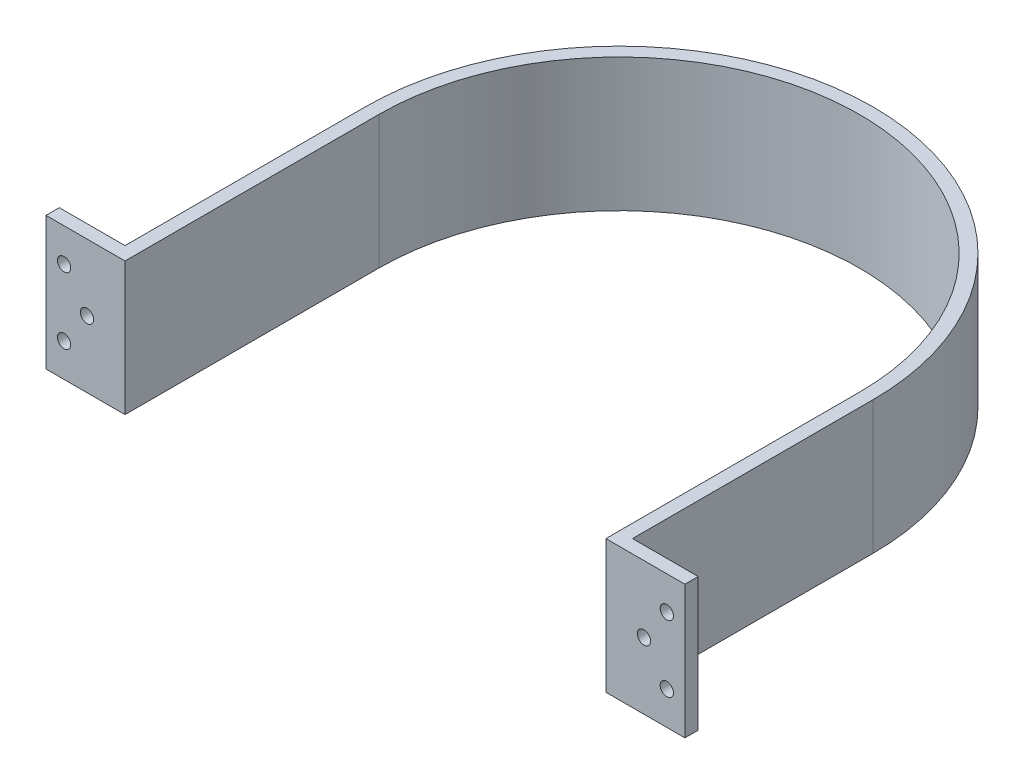
ISO-10303-21;
HEADER;
FILE_DESCRIPTION(('STEP AP214'),'2;1');
FILE_NAME('part.step','',(''),(''),'','','');
FILE_SCHEMA(('AUTOMOTIVE_DESIGN { 1 0 10303 214 1 1 1 1 }'));
ENDSEC;
DATA;
#1=APPLICATION_CONTEXT('core data for automotive mechanical design processes');
#2=APPLICATION_PROTOCOL_DEFINITION('international standard','automotive_design',2000,#1);
#3=PRODUCT_CONTEXT('',#1,'mechanical');
#4=PRODUCT('Part','Part','',(#3));
#5=PRODUCT_RELATED_PRODUCT_CATEGORY('part','',(#4));
#6=PRODUCT_DEFINITION_FORMATION('','',#4);
#7=PRODUCT_DEFINITION_CONTEXT('part definition',#1,'design');
#8=PRODUCT_DEFINITION('design','',#6,#7);
#9=PRODUCT_DEFINITION_SHAPE('','',#8);
#10=(LENGTH_UNIT() NAMED_UNIT(*) SI_UNIT(.MILLI.,.METRE.));
#11=(NAMED_UNIT(*) PLANE_ANGLE_UNIT() SI_UNIT($,.RADIAN.));
#12=(NAMED_UNIT(*) SI_UNIT($,.STERADIAN.) SOLID_ANGLE_UNIT());
#13=UNCERTAINTY_MEASURE_WITH_UNIT(LENGTH_MEASURE(1.E-05),#10,'distance_accuracy_value','');
#14=(GEOMETRIC_REPRESENTATION_CONTEXT(3) GLOBAL_UNCERTAINTY_ASSIGNED_CONTEXT((#13)) GLOBAL_UNIT_ASSIGNED_CONTEXT((#10,
#11,#12)) REPRESENTATION_CONTEXT('',''));
#15=CARTESIAN_POINT('',(0.,0.,0.));
#16=DIRECTION('',(0.,0.,1.));
#17=DIRECTION('',(1.,0.,0.));
#18=AXIS2_PLACEMENT_3D('',#15,#16,#17);
#19=CARTESIAN_POINT('',(0.,31.75,114.7));
#20=DIRECTION('',(0.,0.,1.));
#21=DIRECTION('',(1.,0.,0.));
#22=AXIS2_PLACEMENT_3D('',#19,#20,#21);
#23=PLANE('',#22);
#24=CARTESIAN_POINT('',(-132.85625,0.,114.7));
#25=DIRECTION('',(0.,0.,1.));
#26=DIRECTION('',(1.,0.,0.));
#27=AXIS2_PLACEMENT_3D('',#24,#25,#26);
#28=CIRCLE('',#27,3.175);
#29=CARTESIAN_POINT('',(-129.68125,0.,114.7));
#30=VERTEX_POINT('',#29);
#31=EDGE_CURVE('E166',#30,#30,#28,.T.);
#32=ORIENTED_EDGE('',*,*,#31,.T.);
#33=EDGE_LOOP('',(#32));
#34=FACE_BOUND('',#33,.T.);
#35=CARTESIAN_POINT('',(-143.76875,15.875,114.7));
#36=DIRECTION('',(0.,0.,1.));
#37=DIRECTION('',(1.,0.,0.));
#38=AXIS2_PLACEMENT_3D('',#35,#36,#37);
#39=CIRCLE('',#38,3.175);
#40=CARTESIAN_POINT('',(-140.59375,15.875,114.7));
#41=VERTEX_POINT('',#40);
#42=EDGE_CURVE('E218',#41,#41,#39,.T.);
#43=ORIENTED_EDGE('',*,*,#42,.T.);
#44=EDGE_LOOP('',(#43));
#45=FACE_BOUND('',#44,.T.);
#46=DIRECTION('',(-1.,0.,0.));
#47=VECTOR('',#46,1.);
#48=CARTESIAN_POINT('',(0.,-31.75,114.7));
#49=LINE('',#48,#47);
#50=CARTESIAN_POINT('',(-121.05,-31.75,114.7));
#51=VERTEX_POINT('',#50);
#52=CARTESIAN_POINT('',(-152.4,-31.75,114.7));
#53=VERTEX_POINT('',#52);
#54=EDGE_CURVE('E162',#51,#53,#49,.T.);
#55=ORIENTED_EDGE('',*,*,#54,.T.);
#56=DIRECTION('',(0.,-1.,0.));
#57=VECTOR('',#56,1.);
#58=CARTESIAN_POINT('',(-152.4,31.75,114.7));
#59=LINE('',#58,#57);
#60=CARTESIAN_POINT('',(-152.4,31.75,114.7));
#61=VERTEX_POINT('',#60);
#62=EDGE_CURVE('E11',#61,#53,#59,.T.);
#63=ORIENTED_EDGE('',*,*,#62,.F.);
#64=DIRECTION('',(-1.,0.,0.));
#65=VECTOR('',#64,1.);
#66=CARTESIAN_POINT('',(0.,31.75,114.7));
#67=LINE('',#66,#65);
#68=CARTESIAN_POINT('',(-121.05,31.75,114.7));
#69=VERTEX_POINT('',#68);
#70=EDGE_CURVE('E192',#69,#61,#67,.T.);
#71=ORIENTED_EDGE('',*,*,#70,.F.);
#72=DIRECTION('',(0.,-1.,0.));
#73=VECTOR('',#72,1.);
#74=CARTESIAN_POINT('',(-121.05,31.75,114.7));
#75=LINE('',#74,#73);
#76=EDGE_CURVE('E161',#69,#51,#75,.T.);
#77=ORIENTED_EDGE('',*,*,#76,.T.);
#78=EDGE_LOOP('',(#55,#63,#71,#77));
#79=FACE_BOUND('',#78,.T.);
#80=CARTESIAN_POINT('',(-143.76875,-15.875,114.7));
#81=DIRECTION('',(0.,0.,1.));
#82=DIRECTION('',(1.,0.,0.));
#83=AXIS2_PLACEMENT_3D('',#80,#81,#82);
#84=CIRCLE('',#83,3.175);
#85=CARTESIAN_POINT('',(-140.59375,-15.875,114.7));
#86=VERTEX_POINT('',#85);
#87=EDGE_CURVE('E222',#86,#86,#84,.F.);
#88=ORIENTED_EDGE('',*,*,#87,.F.);
#89=EDGE_LOOP('',(#88));
#90=FACE_BOUND('',#89,.T.);
#91=ADVANCED_FACE('F38',(#34,#45,#79,#90),#23,.F.);
#92=CARTESIAN_POINT('',(0.,31.75,121.05));
#93=DIRECTION('',(0.,0.,1.));
#94=DIRECTION('',(1.,0.,0.));
#95=AXIS2_PLACEMENT_3D('',#92,#93,#94);
#96=PLANE('',#95);
#97=CARTESIAN_POINT('',(-132.85625,0.,121.05));
#98=DIRECTION('',(0.,0.,1.));
#99=DIRECTION('',(1.,0.,0.));
#100=AXIS2_PLACEMENT_3D('',#97,#98,#99);
#101=CIRCLE('',#100,3.175);
#102=CARTESIAN_POINT('',(-129.68125,0.,121.05));
#103=VERTEX_POINT('',#102);
#104=EDGE_CURVE('E327',#103,#103,#101,.T.);
#105=ORIENTED_EDGE('',*,*,#104,.F.);
#106=EDGE_LOOP('',(#105));
#107=FACE_BOUND('',#106,.T.);
#108=DIRECTION('',(-1.,0.,0.));
#109=VECTOR('',#108,1.);
#110=CARTESIAN_POINT('',(0.,-31.75,121.05));
#111=LINE('',#110,#109);
#112=CARTESIAN_POINT('',(-114.7,-31.75,121.05));
#113=VERTEX_POINT('',#112);
#114=CARTESIAN_POINT('',(-152.4,-31.75,121.05));
#115=VERTEX_POINT('',#114);
#116=EDGE_CURVE('E169',#113,#115,#111,.T.);
#117=ORIENTED_EDGE('',*,*,#116,.F.);
#118=DIRECTION('',(0.,-1.,0.));
#119=VECTOR('',#118,1.);
#120=CARTESIAN_POINT('',(-114.7,31.75,121.05));
#121=LINE('',#120,#119);
#122=CARTESIAN_POINT('',(-114.7,31.75,121.05));
#123=VERTEX_POINT('',#122);
#124=EDGE_CURVE('E207',#123,#113,#121,.T.);
#125=ORIENTED_EDGE('',*,*,#124,.F.);
#126=DIRECTION('',(-1.,0.,0.));
#127=VECTOR('',#126,1.);
#128=CARTESIAN_POINT('',(0.,31.75,121.05));
#129=LINE('',#128,#127);
#130=CARTESIAN_POINT('',(-152.4,31.75,121.05));
#131=VERTEX_POINT('',#130);
#132=EDGE_CURVE('E235',#123,#131,#129,.T.);
#133=ORIENTED_EDGE('',*,*,#132,.T.);
#134=DIRECTION('',(0.,-1.,0.));
#135=VECTOR('',#134,1.);
#136=CARTESIAN_POINT('',(-152.4,31.75,121.05));
#137=LINE('',#136,#135);
#138=EDGE_CURVE('E47',#131,#115,#137,.T.);
#139=ORIENTED_EDGE('',*,*,#138,.T.);
#140=EDGE_LOOP('',(#117,#125,#133,#139));
#141=FACE_BOUND('',#140,.T.);
#142=CARTESIAN_POINT('',(-143.76875,15.875,121.05));
#143=DIRECTION('',(0.,0.,1.));
#144=DIRECTION('',(1.,0.,0.));
#145=AXIS2_PLACEMENT_3D('',#142,#143,#144);
#146=CIRCLE('',#145,3.175);
#147=CARTESIAN_POINT('',(-140.59375,15.875,121.05));
#148=VERTEX_POINT('',#147);
#149=EDGE_CURVE('E213',#148,#148,#146,.T.);
#150=ORIENTED_EDGE('',*,*,#149,.F.);
#151=EDGE_LOOP('',(#150));
#152=FACE_BOUND('',#151,.T.);
#153=CARTESIAN_POINT('',(-143.76875,-15.875,121.05));
#154=DIRECTION('',(0.,0.,-1.));
#155=DIRECTION('',(-1.,0.,0.));
#156=AXIS2_PLACEMENT_3D('',#153,#154,#155);
#157=CIRCLE('',#156,3.175);
#158=CARTESIAN_POINT('',(-146.94375,-15.875,121.05));
#159=VERTEX_POINT('',#158);
#160=EDGE_CURVE('E329',#159,#159,#157,.T.);
#161=ORIENTED_EDGE('',*,*,#160,.T.);
#162=EDGE_LOOP('',(#161));
#163=FACE_BOUND('',#162,.T.);
#164=ADVANCED_FACE('F274',(#107,#141,#152,#163),#96,.T.);
#165=CARTESIAN_POINT('',(0.,31.75,121.05));
#166=DIRECTION('',(0.,0.,-1.));
#167=DIRECTION('',(-1.,0.,0.));
#168=AXIS2_PLACEMENT_3D('',#165,#166,#167);
#169=PLANE('',#168);
#170=CARTESIAN_POINT('',(143.76875,-15.875,121.05));
#171=DIRECTION('',(0.,0.,1.));
#172=DIRECTION('',(1.,0.,0.));
#173=AXIS2_PLACEMENT_3D('',#170,#171,#172);
#174=CIRCLE('',#173,3.175);
#175=CARTESIAN_POINT('',(146.94375,-15.875,121.05));
#176=VERTEX_POINT('',#175);
#177=EDGE_CURVE('E320',#176,#176,#174,.T.);
#178=ORIENTED_EDGE('',*,*,#177,.F.);
#179=EDGE_LOOP('',(#178));
#180=FACE_BOUND('',#179,.T.);
#181=DIRECTION('',(1.,0.,0.));
#182=VECTOR('',#181,1.);
#183=CARTESIAN_POINT('',(0.,-31.75,121.05));
#184=LINE('',#183,#182);
#185=CARTESIAN_POINT('',(114.7,-31.75,121.05));
#186=VERTEX_POINT('',#185);
#187=CARTESIAN_POINT('',(152.4,-31.75,121.05));
#188=VERTEX_POINT('',#187);
#189=EDGE_CURVE('E180',#186,#188,#184,.T.);
#190=ORIENTED_EDGE('',*,*,#189,.T.);
#191=DIRECTION('',(0.,-1.,0.));
#192=VECTOR('',#191,1.);
#193=CARTESIAN_POINT('',(152.4,31.75,121.05));
#194=LINE('',#193,#192);
#195=CARTESIAN_POINT('',(152.4,31.75,121.05));
#196=VERTEX_POINT('',#195);
#197=EDGE_CURVE('E198',#196,#188,#194,.T.);
#198=ORIENTED_EDGE('',*,*,#197,.F.);
#199=DIRECTION('',(1.,0.,0.));
#200=VECTOR('',#199,1.);
#201=CARTESIAN_POINT('',(0.,31.75,121.05));
#202=LINE('',#201,#200);
#203=CARTESIAN_POINT('',(114.7,31.75,121.05));
#204=VERTEX_POINT('',#203);
#205=EDGE_CURVE('E246',#204,#196,#202,.T.);
#206=ORIENTED_EDGE('',*,*,#205,.F.);
#207=DIRECTION('',(0.,-1.,0.));
#208=VECTOR('',#207,1.);
#209=CARTESIAN_POINT('',(114.7,31.75,121.05));
#210=LINE('',#209,#208);
#211=EDGE_CURVE('E200',#204,#186,#210,.T.);
#212=ORIENTED_EDGE('',*,*,#211,.T.);
#213=EDGE_LOOP('',(#190,#198,#206,#212));
#214=FACE_BOUND('',#213,.T.);
#215=CARTESIAN_POINT('',(143.76875,15.875,121.05));
#216=DIRECTION('',(0.,0.,-1.));
#217=DIRECTION('',(-1.,0.,0.));
#218=AXIS2_PLACEMENT_3D('',#215,#216,#217);
#219=CIRCLE('',#218,3.175);
#220=CARTESIAN_POINT('',(140.59375,15.875,121.05));
#221=VERTEX_POINT('',#220);
#222=EDGE_CURVE('E322',#221,#221,#219,.T.);
#223=ORIENTED_EDGE('',*,*,#222,.T.);
#224=EDGE_LOOP('',(#223));
#225=FACE_BOUND('',#224,.T.);
#226=CARTESIAN_POINT('',(132.85625,0.,121.05));
#227=DIRECTION('',(0.,0.,-1.));
#228=DIRECTION('',(-1.,0.,0.));
#229=AXIS2_PLACEMENT_3D('',#226,#227,#228);
#230=CIRCLE('',#229,3.175);
#231=CARTESIAN_POINT('',(129.68125,0.,121.05));
#232=VERTEX_POINT('',#231);
#233=EDGE_CURVE('E325',#232,#232,#230,.T.);
#234=ORIENTED_EDGE('',*,*,#233,.T.);
#235=EDGE_LOOP('',(#234));
#236=FACE_BOUND('',#235,.T.);
#237=ADVANCED_FACE('F279',(#180,#214,#225,#236),#169,.F.);
#238=CARTESIAN_POINT('',(0.,31.75,114.7));
#239=DIRECTION('',(0.,0.,-1.));
#240=DIRECTION('',(-1.,0.,0.));
#241=AXIS2_PLACEMENT_3D('',#238,#239,#240);
#242=PLANE('',#241);
#243=CARTESIAN_POINT('',(143.76875,15.875,114.7));
#244=DIRECTION('',(0.,0.,-1.));
#245=DIRECTION('',(-1.,0.,0.));
#246=AXIS2_PLACEMENT_3D('',#243,#244,#245);
#247=CIRCLE('',#246,3.175);
#248=CARTESIAN_POINT('',(140.59375,15.875,114.7));
#249=VERTEX_POINT('',#248);
#250=EDGE_CURVE('E212',#249,#249,#247,.F.);
#251=ORIENTED_EDGE('',*,*,#250,.T.);
#252=EDGE_LOOP('',(#251));
#253=FACE_BOUND('',#252,.T.);
#254=CARTESIAN_POINT('',(143.76875,-15.875,114.7));
#255=DIRECTION('',(0.,0.,-1.));
#256=DIRECTION('',(-1.,0.,0.));
#257=AXIS2_PLACEMENT_3D('',#254,#255,#256);
#258=CIRCLE('',#257,3.175);
#259=CARTESIAN_POINT('',(140.59375,-15.875,114.7));
#260=VERTEX_POINT('',#259);
#261=EDGE_CURVE('E210',#260,#260,#258,.T.);
#262=ORIENTED_EDGE('',*,*,#261,.F.);
#263=EDGE_LOOP('',(#262));
#264=FACE_BOUND('',#263,.T.);
#265=DIRECTION('',(1.,0.,0.));
#266=VECTOR('',#265,1.);
#267=CARTESIAN_POINT('',(0.,-31.75,114.7));
#268=LINE('',#267,#266);
#269=CARTESIAN_POINT('',(121.05,-31.75,114.7));
#270=VERTEX_POINT('',#269);
#271=CARTESIAN_POINT('',(152.4,-31.75,114.7));
#272=VERTEX_POINT('',#271);
#273=EDGE_CURVE('E186',#270,#272,#268,.T.);
#274=ORIENTED_EDGE('',*,*,#273,.F.);
#275=DIRECTION('',(0.,-1.,0.));
#276=VECTOR('',#275,1.);
#277=CARTESIAN_POINT('',(121.05,31.75,114.7));
#278=LINE('',#277,#276);
#279=CARTESIAN_POINT('',(121.05,31.75,114.7));
#280=VERTEX_POINT('',#279);
#281=EDGE_CURVE('E144',#280,#270,#278,.T.);
#282=ORIENTED_EDGE('',*,*,#281,.F.);
#283=DIRECTION('',(1.,0.,0.));
#284=VECTOR('',#283,1.);
#285=CARTESIAN_POINT('',(0.,31.75,114.7));
#286=LINE('',#285,#284);
#287=CARTESIAN_POINT('',(152.4,31.75,114.7));
#288=VERTEX_POINT('',#287);
#289=EDGE_CURVE('E154',#280,#288,#286,.T.);
#290=ORIENTED_EDGE('',*,*,#289,.T.);
#291=DIRECTION('',(0.,-1.,0.));
#292=VECTOR('',#291,1.);
#293=CARTESIAN_POINT('',(152.4,31.75,114.7));
#294=LINE('',#293,#292);
#295=EDGE_CURVE('E196',#288,#272,#294,.T.);
#296=ORIENTED_EDGE('',*,*,#295,.T.);
#297=EDGE_LOOP('',(#274,#282,#290,#296));
#298=FACE_BOUND('',#297,.T.);
#299=CARTESIAN_POINT('',(132.85625,0.,114.7));
#300=DIRECTION('',(0.,0.,-1.));
#301=DIRECTION('',(-1.,0.,0.));
#302=AXIS2_PLACEMENT_3D('',#299,#300,#301);
#303=CIRCLE('',#302,3.175);
#304=CARTESIAN_POINT('',(129.68125,0.,114.7));
#305=VERTEX_POINT('',#304);
#306=EDGE_CURVE('E41',#305,#305,#303,.F.);
#307=ORIENTED_EDGE('',*,*,#306,.T.);
#308=EDGE_LOOP('',(#307));
#309=FACE_BOUND('',#308,.T.);
#310=ADVANCED_FACE('F255',(#253,#264,#298,#309),#242,.T.);
#311=CARTESIAN_POINT('',(-152.4,31.75,0.));
#312=DIRECTION('',(1.,0.,0.));
#313=DIRECTION('',(0.,0.,-1.));
#314=AXIS2_PLACEMENT_3D('',#311,#312,#313);
#315=PLANE('',#314);
#316=DIRECTION('',(0.,0.,1.));
#317=VECTOR('',#316,1.);
#318=CARTESIAN_POINT('',(-152.4,-31.75,0.));
#319=LINE('',#318,#317);
#320=EDGE_CURVE('E165',#53,#115,#319,.T.);
#321=ORIENTED_EDGE('',*,*,#320,.T.);
#322=ORIENTED_EDGE('',*,*,#138,.F.);
#323=DIRECTION('',(0.,0.,1.));
#324=VECTOR('',#323,1.);
#325=CARTESIAN_POINT('',(-152.4,31.75,0.));
#326=LINE('',#325,#324);
#327=EDGE_CURVE('E110',#61,#131,#326,.T.);
#328=ORIENTED_EDGE('',*,*,#327,.F.);
#329=ORIENTED_EDGE('',*,*,#62,.T.);
#330=EDGE_LOOP('',(#321,#322,#328,#329));
#331=FACE_BOUND('',#330,.T.);
#332=ADVANCED_FACE('F341',(#331),#315,.F.);
#333=CARTESIAN_POINT('',(-114.7,31.75,0.));
#334=DIRECTION('',(1.,0.,0.));
#335=DIRECTION('',(0.,0.,-1.));
#336=AXIS2_PLACEMENT_3D('',#333,#334,#335);
#337=PLANE('',#336);
#338=DIRECTION('',(0.,0.,1.));
#339=VECTOR('',#338,1.);
#340=CARTESIAN_POINT('',(-114.7,-31.75,0.));
#341=LINE('',#340,#339);
#342=CARTESIAN_POINT('',(-114.7,-31.75,0.));
#343=VERTEX_POINT('',#342);
#344=EDGE_CURVE('E172',#343,#113,#341,.T.);
#345=ORIENTED_EDGE('',*,*,#344,.F.);
#346=DIRECTION('',(0.,-1.,0.));
#347=VECTOR('',#346,1.);
#348=CARTESIAN_POINT('',(-114.7,31.75,0.));
#349=LINE('',#348,#347);
#350=CARTESIAN_POINT('',(-114.7,31.75,0.));
#351=VERTEX_POINT('',#350);
#352=EDGE_CURVE('E205',#351,#343,#349,.T.);
#353=ORIENTED_EDGE('',*,*,#352,.F.);
#354=DIRECTION('',(0.,0.,1.));
#355=VECTOR('',#354,1.);
#356=CARTESIAN_POINT('',(-114.7,31.75,0.));
#357=LINE('',#356,#355);
#358=EDGE_CURVE('E238',#351,#123,#357,.T.);
#359=ORIENTED_EDGE('',*,*,#358,.T.);
#360=ORIENTED_EDGE('',*,*,#124,.T.);
#361=EDGE_LOOP('',(#345,#353,#359,#360));
#362=FACE_BOUND('',#361,.T.);
#363=ADVANCED_FACE('F353',(#362),#337,.T.);
#364=CARTESIAN_POINT('',(0.,31.75,0.));
#365=DIRECTION('',(0.,-1.,0.));
#366=DIRECTION('',(0.,0.,-1.));
#367=AXIS2_PLACEMENT_3D('',#364,#365,#366);
#368=CYLINDRICAL_SURFACE('',#367,114.7);
#369=CARTESIAN_POINT('',(0.,-31.75,0.));
#370=DIRECTION('',(0.,1.,0.));
#371=DIRECTION('',(0.,0.,1.));
#372=AXIS2_PLACEMENT_3D('',#369,#370,#371);
#373=CIRCLE('',#372,114.7);
#374=CARTESIAN_POINT('',(114.7,-31.75,0.));
#375=VERTEX_POINT('',#374);
#376=EDGE_CURVE('E175',#375,#343,#373,.T.);
#377=ORIENTED_EDGE('',*,*,#376,.F.);
#378=DIRECTION('',(0.,-1.,0.));
#379=VECTOR('',#378,1.);
#380=CARTESIAN_POINT('',(114.7,31.75,0.));
#381=LINE('',#380,#379);
#382=CARTESIAN_POINT('',(114.7,31.75,0.));
#383=VERTEX_POINT('',#382);
#384=EDGE_CURVE('E203',#383,#375,#381,.T.);
#385=ORIENTED_EDGE('',*,*,#384,.F.);
#386=CARTESIAN_POINT('',(0.,31.75,0.));
#387=DIRECTION('',(0.,1.,0.));
#388=DIRECTION('',(0.,0.,1.));
#389=AXIS2_PLACEMENT_3D('',#386,#387,#388);
#390=CIRCLE('',#389,114.7);
#391=EDGE_CURVE('E241',#383,#351,#390,.T.);
#392=ORIENTED_EDGE('',*,*,#391,.T.);
#393=ORIENTED_EDGE('',*,*,#352,.T.);
#394=EDGE_LOOP('',(#377,#385,#392,#393));
#395=FACE_BOUND('',#394,.T.);
#396=ADVANCED_FACE('F349',(#395),#368,.F.);
#397=CARTESIAN_POINT('',(114.7,31.75,0.));
#398=DIRECTION('',(1.,0.,0.));
#399=DIRECTION('',(0.,0.,-1.));
#400=AXIS2_PLACEMENT_3D('',#397,#398,#399);
#401=PLANE('',#400);
#402=DIRECTION('',(0.,0.,1.));
#403=VECTOR('',#402,1.);
#404=CARTESIAN_POINT('',(114.7,-31.75,0.));
#405=LINE('',#404,#403);
#406=EDGE_CURVE('E178',#375,#186,#405,.T.);
#407=ORIENTED_EDGE('',*,*,#406,.T.);
#408=ORIENTED_EDGE('',*,*,#211,.F.);
#409=DIRECTION('',(0.,0.,1.));
#410=VECTOR('',#409,1.);
#411=CARTESIAN_POINT('',(114.7,31.75,0.));
#412=LINE('',#411,#410);
#413=EDGE_CURVE('E244',#383,#204,#412,.T.);
#414=ORIENTED_EDGE('',*,*,#413,.F.);
#415=ORIENTED_EDGE('',*,*,#384,.T.);
#416=EDGE_LOOP('',(#407,#408,#414,#415));
#417=FACE_BOUND('',#416,.T.);
#418=ADVANCED_FACE('F346',(#417),#401,.F.);
#419=CARTESIAN_POINT('',(152.4,31.75,0.));
#420=DIRECTION('',(1.,0.,0.));
#421=DIRECTION('',(0.,0.,-1.));
#422=AXIS2_PLACEMENT_3D('',#419,#420,#421);
#423=PLANE('',#422);
#424=DIRECTION('',(0.,0.,1.));
#425=VECTOR('',#424,1.);
#426=CARTESIAN_POINT('',(152.4,-31.75,0.));
#427=LINE('',#426,#425);
#428=EDGE_CURVE('E183',#272,#188,#427,.T.);
#429=ORIENTED_EDGE('',*,*,#428,.F.);
#430=ORIENTED_EDGE('',*,*,#295,.F.);
#431=DIRECTION('',(0.,0.,1.));
#432=VECTOR('',#431,1.);
#433=CARTESIAN_POINT('',(152.4,31.75,0.));
#434=LINE('',#433,#432);
#435=EDGE_CURVE('E156',#288,#196,#434,.T.);
#436=ORIENTED_EDGE('',*,*,#435,.T.);
#437=ORIENTED_EDGE('',*,*,#197,.T.);
#438=EDGE_LOOP('',(#429,#430,#436,#437));
#439=FACE_BOUND('',#438,.T.);
#440=ADVANCED_FACE('F250',(#439),#423,.T.);
#441=CARTESIAN_POINT('',(121.05,31.75,0.));
#442=DIRECTION('',(1.,0.,0.));
#443=DIRECTION('',(0.,0.,-1.));
#444=AXIS2_PLACEMENT_3D('',#441,#442,#443);
#445=PLANE('',#444);
#446=DIRECTION('',(0.,0.,1.));
#447=VECTOR('',#446,1.);
#448=CARTESIAN_POINT('',(121.05,-31.75,0.));
#449=LINE('',#448,#447);
#450=CARTESIAN_POINT('',(121.05,-31.75,0.));
#451=VERTEX_POINT('',#450);
#452=EDGE_CURVE('E143',#451,#270,#449,.T.);
#453=ORIENTED_EDGE('',*,*,#452,.F.);
#454=DIRECTION('',(0.,-1.,0.));
#455=VECTOR('',#454,1.);
#456=CARTESIAN_POINT('',(121.05,31.75,0.));
#457=LINE('',#456,#455);
#458=CARTESIAN_POINT('',(121.05,31.75,0.));
#459=VERTEX_POINT('',#458);
#460=EDGE_CURVE('E137',#459,#451,#457,.T.);
#461=ORIENTED_EDGE('',*,*,#460,.F.);
#462=DIRECTION('',(0.,0.,1.));
#463=VECTOR('',#462,1.);
#464=CARTESIAN_POINT('',(121.05,31.75,0.));
#465=LINE('',#464,#463);
#466=EDGE_CURVE('E141',#459,#280,#465,.T.);
#467=ORIENTED_EDGE('',*,*,#466,.T.);
#468=ORIENTED_EDGE('',*,*,#281,.T.);
#469=EDGE_LOOP('',(#453,#461,#467,#468));
#470=FACE_BOUND('',#469,.T.);
#471=ADVANCED_FACE('F139',(#470),#445,.T.);
#472=CARTESIAN_POINT('',(0.,31.75,0.));
#473=DIRECTION('',(0.,-1.,0.));
#474=DIRECTION('',(0.,0.,-1.));
#475=AXIS2_PLACEMENT_3D('',#472,#473,#474);
#476=CYLINDRICAL_SURFACE('',#475,121.05);
#477=CARTESIAN_POINT('',(0.,-31.75,0.));
#478=DIRECTION('',(0.,1.,0.));
#479=DIRECTION('',(0.,0.,1.));
#480=AXIS2_PLACEMENT_3D('',#477,#478,#479);
#481=CIRCLE('',#480,121.05);
#482=CARTESIAN_POINT('',(-121.05,-31.75,0.));
#483=VERTEX_POINT('',#482);
#484=EDGE_CURVE('E96',#451,#483,#481,.T.);
#485=ORIENTED_EDGE('',*,*,#484,.T.);
#486=DIRECTION('',(0.,-1.,0.));
#487=VECTOR('',#486,1.);
#488=CARTESIAN_POINT('',(-121.05,31.75,0.));
#489=LINE('',#488,#487);
#490=CARTESIAN_POINT('',(-121.05,31.75,0.));
#491=VERTEX_POINT('',#490);
#492=EDGE_CURVE('E145',#491,#483,#489,.T.);
#493=ORIENTED_EDGE('',*,*,#492,.F.);
#494=CARTESIAN_POINT('',(0.,31.75,0.));
#495=DIRECTION('',(0.,1.,0.));
#496=DIRECTION('',(0.,0.,1.));
#497=AXIS2_PLACEMENT_3D('',#494,#495,#496);
#498=CIRCLE('',#497,121.05);
#499=EDGE_CURVE('E147',#459,#491,#498,.T.);
#500=ORIENTED_EDGE('',*,*,#499,.F.);
#501=ORIENTED_EDGE('',*,*,#460,.T.);
#502=EDGE_LOOP('',(#485,#493,#500,#501));
#503=FACE_BOUND('',#502,.T.);
#504=ADVANCED_FACE('F148',(#503),#476,.T.);
#505=CARTESIAN_POINT('',(-121.05,31.75,0.));
#506=DIRECTION('',(1.,0.,0.));
#507=DIRECTION('',(0.,0.,-1.));
#508=AXIS2_PLACEMENT_3D('',#505,#506,#507);
#509=PLANE('',#508);
#510=DIRECTION('',(0.,0.,1.));
#511=VECTOR('',#510,1.);
#512=CARTESIAN_POINT('',(-121.05,-31.75,0.));
#513=LINE('',#512,#511);
#514=EDGE_CURVE('E102',#483,#51,#513,.T.);
#515=ORIENTED_EDGE('',*,*,#514,.T.);
#516=ORIENTED_EDGE('',*,*,#76,.F.);
#517=DIRECTION('',(0.,0.,1.));
#518=VECTOR('',#517,1.);
#519=CARTESIAN_POINT('',(-121.05,31.75,0.));
#520=LINE('',#519,#518);
#521=EDGE_CURVE('E56',#491,#69,#520,.T.);
#522=ORIENTED_EDGE('',*,*,#521,.F.);
#523=ORIENTED_EDGE('',*,*,#492,.T.);
#524=EDGE_LOOP('',(#515,#516,#522,#523));
#525=FACE_BOUND('',#524,.T.);
#526=ADVANCED_FACE('F263',(#525),#509,.F.);
#527=CARTESIAN_POINT('',(0.,31.75,0.));
#528=DIRECTION('',(0.,1.,0.));
#529=DIRECTION('',(0.,0.,1.));
#530=AXIS2_PLACEMENT_3D('',#527,#528,#529);
#531=PLANE('',#530);
#532=ORIENTED_EDGE('',*,*,#70,.T.);
#533=ORIENTED_EDGE('',*,*,#327,.T.);
#534=ORIENTED_EDGE('',*,*,#132,.F.);
#535=ORIENTED_EDGE('',*,*,#358,.F.);
#536=ORIENTED_EDGE('',*,*,#391,.F.);
#537=ORIENTED_EDGE('',*,*,#413,.T.);
#538=ORIENTED_EDGE('',*,*,#205,.T.);
#539=ORIENTED_EDGE('',*,*,#435,.F.);
#540=ORIENTED_EDGE('',*,*,#289,.F.);
#541=ORIENTED_EDGE('',*,*,#466,.F.);
#542=ORIENTED_EDGE('',*,*,#499,.T.);
#543=ORIENTED_EDGE('',*,*,#521,.T.);
#544=EDGE_LOOP('',(#532,#533,#534,#535,#536,#537,#538,#539,#540,#541,#542,#543));
#545=FACE_BOUND('',#544,.T.);
#546=ADVANCED_FACE('F151',(#545),#531,.T.);
#547=CARTESIAN_POINT('',(0.,-31.75,0.));
#548=DIRECTION('',(0.,1.,0.));
#549=DIRECTION('',(0.,0.,1.));
#550=AXIS2_PLACEMENT_3D('',#547,#548,#549);
#551=PLANE('',#550);
#552=ORIENTED_EDGE('',*,*,#54,.F.);
#553=ORIENTED_EDGE('',*,*,#514,.F.);
#554=ORIENTED_EDGE('',*,*,#484,.F.);
#555=ORIENTED_EDGE('',*,*,#452,.T.);
#556=ORIENTED_EDGE('',*,*,#273,.T.);
#557=ORIENTED_EDGE('',*,*,#428,.T.);
#558=ORIENTED_EDGE('',*,*,#189,.F.);
#559=ORIENTED_EDGE('',*,*,#406,.F.);
#560=ORIENTED_EDGE('',*,*,#376,.T.);
#561=ORIENTED_EDGE('',*,*,#344,.T.);
#562=ORIENTED_EDGE('',*,*,#116,.T.);
#563=ORIENTED_EDGE('',*,*,#320,.F.);
#564=EDGE_LOOP('',(#552,#553,#554,#555,#556,#557,#558,#559,#560,#561,#562,#563));
#565=FACE_BOUND('',#564,.T.);
#566=ADVANCED_FACE('F258',(#565),#551,.F.);
#567=CARTESIAN_POINT('',(143.76875,-15.875,-121.05));
#568=DIRECTION('',(0.,0.,1.));
#569=DIRECTION('',(1.,0.,0.));
#570=AXIS2_PLACEMENT_3D('',#567,#568,#569);
#571=CYLINDRICAL_SURFACE('',#570,3.175);
#572=ORIENTED_EDGE('',*,*,#261,.T.);
#573=EDGE_LOOP('',(#572));
#574=FACE_BOUND('',#573,.T.);
#575=ORIENTED_EDGE('',*,*,#177,.T.);
#576=EDGE_LOOP('',(#575));
#577=FACE_BOUND('',#576,.T.);
#578=ADVANCED_FACE('F297',(#574,#577),#571,.F.);
#579=CARTESIAN_POINT('',(143.76875,15.875,-121.05));
#580=DIRECTION('',(0.,0.,1.));
#581=DIRECTION('',(1.,0.,0.));
#582=AXIS2_PLACEMENT_3D('',#579,#580,#581);
#583=CYLINDRICAL_SURFACE('',#582,3.175);
#584=ORIENTED_EDGE('',*,*,#250,.F.);
#585=EDGE_LOOP('',(#584));
#586=FACE_BOUND('',#585,.T.);
#587=ORIENTED_EDGE('',*,*,#222,.F.);
#588=EDGE_LOOP('',(#587));
#589=FACE_BOUND('',#588,.T.);
#590=ADVANCED_FACE('F302',(#586,#589),#583,.F.);
#591=CARTESIAN_POINT('',(132.85625,0.,-121.05));
#592=DIRECTION('',(0.,0.,1.));
#593=DIRECTION('',(1.,0.,0.));
#594=AXIS2_PLACEMENT_3D('',#591,#592,#593);
#595=CYLINDRICAL_SURFACE('',#594,3.175);
#596=ORIENTED_EDGE('',*,*,#306,.F.);
#597=EDGE_LOOP('',(#596));
#598=FACE_BOUND('',#597,.T.);
#599=ORIENTED_EDGE('',*,*,#233,.F.);
#600=EDGE_LOOP('',(#599));
#601=FACE_BOUND('',#600,.T.);
#602=ADVANCED_FACE('F299',(#598,#601),#595,.F.);
#603=CARTESIAN_POINT('',(-143.76875,15.875,-121.05));
#604=DIRECTION('',(0.,0.,1.));
#605=DIRECTION('',(1.,0.,0.));
#606=AXIS2_PLACEMENT_3D('',#603,#604,#605);
#607=CYLINDRICAL_SURFACE('',#606,3.175);
#608=ORIENTED_EDGE('',*,*,#149,.T.);
#609=EDGE_LOOP('',(#608));
#610=FACE_BOUND('',#609,.T.);
#611=ORIENTED_EDGE('',*,*,#42,.F.);
#612=EDGE_LOOP('',(#611));
#613=FACE_BOUND('',#612,.T.);
#614=ADVANCED_FACE('F292',(#610,#613),#607,.F.);
#615=CARTESIAN_POINT('',(-143.76875,-15.875,-121.05));
#616=DIRECTION('',(0.,0.,1.));
#617=DIRECTION('',(1.,0.,0.));
#618=AXIS2_PLACEMENT_3D('',#615,#616,#617);
#619=CYLINDRICAL_SURFACE('',#618,3.175);
#620=ORIENTED_EDGE('',*,*,#160,.F.);
#621=EDGE_LOOP('',(#620));
#622=FACE_BOUND('',#621,.T.);
#623=ORIENTED_EDGE('',*,*,#87,.T.);
#624=EDGE_LOOP('',(#623));
#625=FACE_BOUND('',#624,.T.);
#626=ADVANCED_FACE('F286',(#622,#625),#619,.F.);
#627=CARTESIAN_POINT('',(-132.85625,0.,-121.05));
#628=DIRECTION('',(0.,0.,1.));
#629=DIRECTION('',(1.,0.,0.));
#630=AXIS2_PLACEMENT_3D('',#627,#628,#629);
#631=CYLINDRICAL_SURFACE('',#630,3.175);
#632=ORIENTED_EDGE('',*,*,#104,.T.);
#633=EDGE_LOOP('',(#632));
#634=FACE_BOUND('',#633,.T.);
#635=ORIENTED_EDGE('',*,*,#31,.F.);
#636=EDGE_LOOP('',(#635));
#637=FACE_BOUND('',#636,.T.);
#638=ADVANCED_FACE('F284',(#634,#637),#631,.F.);
#639=CLOSED_SHELL('',(#91,#164,#237,#310,#332,#363,#396,#418,#440,#471,#504,#526,#546,#566,#578,
#590,#602,#614,#626,#638));
#640=MANIFOLD_SOLID_BREP('B2',#639);
#641=ADVANCED_BREP_SHAPE_REPRESENTATION('',(#18,#640),#14);
#642=SHAPE_DEFINITION_REPRESENTATION(#9,#641);
ENDSEC;
END-ISO-10303-21;
